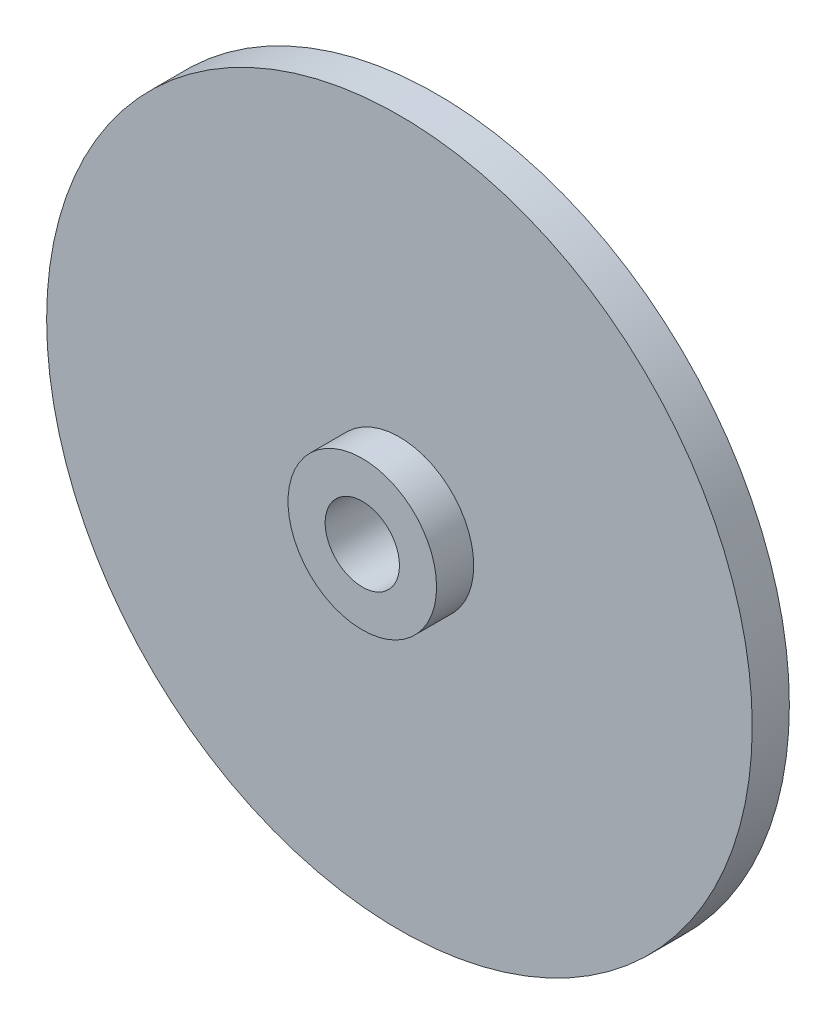
ISO-10303-21;
HEADER;
FILE_DESCRIPTION(('STEP AP214'),'2;1');
FILE_NAME('part.step','',(''),(''),'','','');
FILE_SCHEMA(('AUTOMOTIVE_DESIGN { 1 0 10303 214 1 1 1 1 }'));
ENDSEC;
DATA;
#1=APPLICATION_CONTEXT('core data for automotive mechanical design processes');
#2=APPLICATION_PROTOCOL_DEFINITION('international standard','automotive_design',2000,#1);
#3=PRODUCT_CONTEXT('',#1,'mechanical');
#4=PRODUCT('Part','Part','',(#3));
#5=PRODUCT_RELATED_PRODUCT_CATEGORY('part','',(#4));
#6=PRODUCT_DEFINITION_FORMATION('','',#4);
#7=PRODUCT_DEFINITION_CONTEXT('part definition',#1,'design');
#8=PRODUCT_DEFINITION('design','',#6,#7);
#9=PRODUCT_DEFINITION_SHAPE('','',#8);
#10=(LENGTH_UNIT() NAMED_UNIT(*) SI_UNIT(.MILLI.,.METRE.));
#11=(NAMED_UNIT(*) PLANE_ANGLE_UNIT() SI_UNIT($,.RADIAN.));
#12=(NAMED_UNIT(*) SI_UNIT($,.STERADIAN.) SOLID_ANGLE_UNIT());
#13=UNCERTAINTY_MEASURE_WITH_UNIT(LENGTH_MEASURE(1.E-05),#10,'distance_accuracy_value','');
#14=(GEOMETRIC_REPRESENTATION_CONTEXT(3) GLOBAL_UNCERTAINTY_ASSIGNED_CONTEXT((#13)) GLOBAL_UNIT_ASSIGNED_CONTEXT((#10,
#11,#12)) REPRESENTATION_CONTEXT('',''));
#15=CARTESIAN_POINT('',(0.,0.,0.));
#16=DIRECTION('',(0.,0.,1.));
#17=DIRECTION('',(1.,0.,0.));
#18=AXIS2_PLACEMENT_3D('',#15,#16,#17);
#19=CARTESIAN_POINT('',(0.,0.,1.));
#20=DIRECTION('',(0.,0.,-1.));
#21=DIRECTION('',(-1.,0.,0.));
#22=AXIS2_PLACEMENT_3D('',#19,#20,#21);
#23=CYLINDRICAL_SURFACE('',#22,9.5);
#24=CARTESIAN_POINT('',(0.,0.,1.));
#25=DIRECTION('',(0.,0.,1.));
#26=DIRECTION('',(1.,0.,0.));
#27=AXIS2_PLACEMENT_3D('',#24,#25,#26);
#28=CIRCLE('',#27,9.5);
#29=CARTESIAN_POINT('',(9.5,0.,1.));
#30=VERTEX_POINT('',#29);
#31=EDGE_CURVE('E10',#30,#30,#28,.T.);
#32=ORIENTED_EDGE('',*,*,#31,.F.);
#33=EDGE_LOOP('',(#32));
#34=FACE_BOUND('',#33,.T.);
#35=CARTESIAN_POINT('',(0.,0.,0.));
#36=DIRECTION('',(0.,0.,1.));
#37=DIRECTION('',(1.,0.,0.));
#38=AXIS2_PLACEMENT_3D('',#35,#36,#37);
#39=CIRCLE('',#38,9.5);
#40=CARTESIAN_POINT('',(9.5,0.,0.));
#41=VERTEX_POINT('',#40);
#42=EDGE_CURVE('E42',#41,#41,#39,.T.);
#43=ORIENTED_EDGE('',*,*,#42,.T.);
#44=EDGE_LOOP('',(#43));
#45=FACE_BOUND('',#44,.T.);
#46=ADVANCED_FACE('F39',(#34,#45),#23,.T.);
#47=CARTESIAN_POINT('',(0.,0.,1.));
#48=DIRECTION('',(0.,0.,1.));
#49=DIRECTION('',(1.,0.,0.));
#50=AXIS2_PLACEMENT_3D('',#47,#48,#49);
#51=PLANE('',#50);
#52=CARTESIAN_POINT('',(0.,0.,1.));
#53=DIRECTION('',(0.,0.,1.));
#54=DIRECTION('',(1.,0.,0.));
#55=AXIS2_PLACEMENT_3D('',#52,#53,#54);
#56=CIRCLE('',#55,2.);
#57=CARTESIAN_POINT('',(2.,0.,1.));
#58=VERTEX_POINT('',#57);
#59=EDGE_CURVE('E47',#58,#58,#56,.T.);
#60=ORIENTED_EDGE('',*,*,#59,.F.);
#61=EDGE_LOOP('',(#60));
#62=FACE_BOUND('',#61,.T.);
#63=ORIENTED_EDGE('',*,*,#31,.T.);
#64=EDGE_LOOP('',(#63));
#65=FACE_BOUND('',#64,.T.);
#66=ADVANCED_FACE('F84',(#62,#65),#51,.T.);
#67=CARTESIAN_POINT('',(0.,0.,0.));
#68=DIRECTION('',(0.,0.,1.));
#69=DIRECTION('',(1.,0.,0.));
#70=AXIS2_PLACEMENT_3D('',#67,#68,#69);
#71=PLANE('',#70);
#72=ORIENTED_EDGE('',*,*,#42,.F.);
#73=EDGE_LOOP('',(#72));
#74=FACE_BOUND('',#73,.T.);
#75=CARTESIAN_POINT('',(0.,0.,0.));
#76=DIRECTION('',(0.,0.,1.));
#77=DIRECTION('',(1.,0.,0.));
#78=AXIS2_PLACEMENT_3D('',#75,#76,#77);
#79=CIRCLE('',#78,1.);
#80=CARTESIAN_POINT('',(1.,0.,0.));
#81=VERTEX_POINT('',#80);
#82=EDGE_CURVE('E54',#81,#81,#79,.T.);
#83=ORIENTED_EDGE('',*,*,#82,.T.);
#84=EDGE_LOOP('',(#83));
#85=FACE_BOUND('',#84,.T.);
#86=ADVANCED_FACE('F81',(#74,#85),#71,.F.);
#87=CARTESIAN_POINT('',(0.,0.,2.));
#88=DIRECTION('',(0.,0.,-1.));
#89=DIRECTION('',(-1.,0.,0.));
#90=AXIS2_PLACEMENT_3D('',#87,#88,#89);
#91=CYLINDRICAL_SURFACE('',#90,1.);
#92=CARTESIAN_POINT('',(0.,0.,2.));
#93=DIRECTION('',(0.,0.,1.));
#94=DIRECTION('',(1.,0.,0.));
#95=AXIS2_PLACEMENT_3D('',#92,#93,#94);
#96=CIRCLE('',#95,1.);
#97=CARTESIAN_POINT('',(1.,0.,2.));
#98=VERTEX_POINT('',#97);
#99=EDGE_CURVE('E58',#98,#98,#96,.T.);
#100=ORIENTED_EDGE('',*,*,#99,.T.);
#101=EDGE_LOOP('',(#100));
#102=FACE_BOUND('',#101,.T.);
#103=ORIENTED_EDGE('',*,*,#82,.F.);
#104=EDGE_LOOP('',(#103));
#105=FACE_BOUND('',#104,.T.);
#106=ADVANCED_FACE('F65',(#102,#105),#91,.F.);
#107=CARTESIAN_POINT('',(0.,0.,2.));
#108=DIRECTION('',(0.,0.,-1.));
#109=DIRECTION('',(-1.,0.,0.));
#110=AXIS2_PLACEMENT_3D('',#107,#108,#109);
#111=CYLINDRICAL_SURFACE('',#110,2.);
#112=ORIENTED_EDGE('',*,*,#59,.T.);
#113=EDGE_LOOP('',(#112));
#114=FACE_BOUND('',#113,.T.);
#115=CARTESIAN_POINT('',(0.,0.,2.));
#116=DIRECTION('',(0.,0.,1.));
#117=DIRECTION('',(1.,0.,0.));
#118=AXIS2_PLACEMENT_3D('',#115,#116,#117);
#119=CIRCLE('',#118,2.);
#120=CARTESIAN_POINT('',(2.,0.,2.));
#121=VERTEX_POINT('',#120);
#122=EDGE_CURVE('E59',#121,#121,#119,.T.);
#123=ORIENTED_EDGE('',*,*,#122,.F.);
#124=EDGE_LOOP('',(#123));
#125=FACE_BOUND('',#124,.T.);
#126=ADVANCED_FACE('F71',(#114,#125),#111,.T.);
#127=CARTESIAN_POINT('',(0.,0.,2.));
#128=DIRECTION('',(0.,0.,1.));
#129=DIRECTION('',(1.,0.,0.));
#130=AXIS2_PLACEMENT_3D('',#127,#128,#129);
#131=PLANE('',#130);
#132=ORIENTED_EDGE('',*,*,#99,.F.);
#133=EDGE_LOOP('',(#132));
#134=FACE_BOUND('',#133,.T.);
#135=ORIENTED_EDGE('',*,*,#122,.T.);
#136=EDGE_LOOP('',(#135));
#137=FACE_BOUND('',#136,.T.);
#138=ADVANCED_FACE('F68',(#134,#137),#131,.T.);
#139=CLOSED_SHELL('',(#46,#66,#86,#106,#126,#138));
#140=MANIFOLD_SOLID_BREP('B2',#139);
#141=ADVANCED_BREP_SHAPE_REPRESENTATION('',(#18,#140),#14);
#142=SHAPE_DEFINITION_REPRESENTATION(#9,#141);
ENDSEC;
END-ISO-10303-21;
